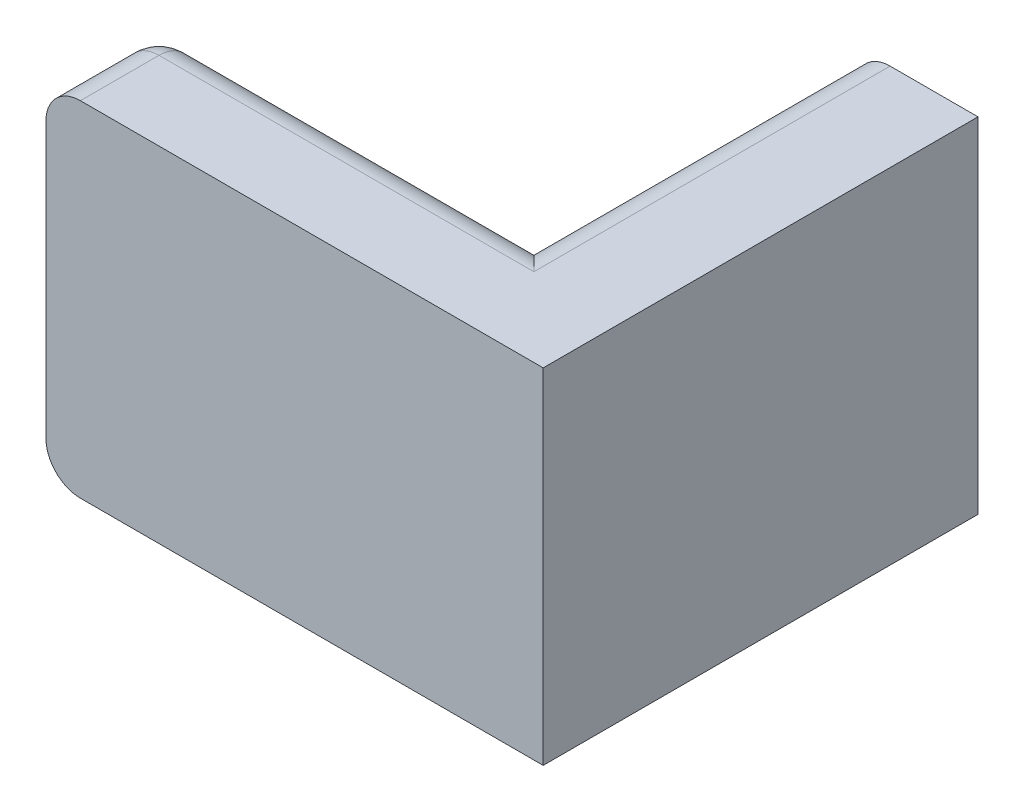
ISO-10303-21;
HEADER;
FILE_DESCRIPTION(('STEP AP214'),'2;1');
FILE_NAME('part.step','',(''),(''),'','','');
FILE_SCHEMA(('AUTOMOTIVE_DESIGN { 1 0 10303 214 1 1 1 1 }'));
ENDSEC;
DATA;
#1=APPLICATION_CONTEXT('core data for automotive mechanical design processes');
#2=APPLICATION_PROTOCOL_DEFINITION('international standard','automotive_design',2000,#1);
#3=PRODUCT_CONTEXT('',#1,'mechanical');
#4=PRODUCT('Part','Part','',(#3));
#5=PRODUCT_RELATED_PRODUCT_CATEGORY('part','',(#4));
#6=PRODUCT_DEFINITION_FORMATION('','',#4);
#7=PRODUCT_DEFINITION_CONTEXT('part definition',#1,'design');
#8=PRODUCT_DEFINITION('design','',#6,#7);
#9=PRODUCT_DEFINITION_SHAPE('','',#8);
#10=(LENGTH_UNIT() NAMED_UNIT(*) SI_UNIT(.MILLI.,.METRE.));
#11=(NAMED_UNIT(*) PLANE_ANGLE_UNIT() SI_UNIT($,.RADIAN.));
#12=(NAMED_UNIT(*) SI_UNIT($,.STERADIAN.) SOLID_ANGLE_UNIT());
#13=UNCERTAINTY_MEASURE_WITH_UNIT(LENGTH_MEASURE(1.E-05),#10,'distance_accuracy_value','');
#14=(GEOMETRIC_REPRESENTATION_CONTEXT(3) GLOBAL_UNCERTAINTY_ASSIGNED_CONTEXT((#13)) GLOBAL_UNIT_ASSIGNED_CONTEXT((#10,
#11,#12)) REPRESENTATION_CONTEXT('',''));
#15=CARTESIAN_POINT('',(0.,0.,0.));
#16=DIRECTION('',(0.,0.,1.));
#17=DIRECTION('',(1.,0.,0.));
#18=AXIS2_PLACEMENT_3D('',#15,#16,#17);
#19=CARTESIAN_POINT('',(0.,50.,-16.4145796064401));
#20=DIRECTION('',(1.,0.,0.));
#21=DIRECTION('',(0.,0.,-1.));
#22=AXIS2_PLACEMENT_3D('',#19,#20,#21);
#23=PLANE('',#22);
#24=DIRECTION('',(0.,-1.,0.));
#25=VECTOR('',#24,1.);
#26=CARTESIAN_POINT('',(0.,50.,0.));
#27=LINE('',#26,#25);
#28=CARTESIAN_POINT('',(0.,45.,0.));
#29=VERTEX_POINT('',#28);
#30=CARTESIAN_POINT('',(0.,5.,0.));
#31=VERTEX_POINT('',#30);
#32=EDGE_CURVE('E137',#29,#31,#27,.T.);
#33=ORIENTED_EDGE('',*,*,#32,.F.);
#34=DIRECTION('',(0.,0.,1.));
#35=VECTOR('',#34,1.);
#36=CARTESIAN_POINT('',(0.,45.,-16.4145796064401));
#37=LINE('',#36,#35);
#38=CARTESIAN_POINT('',(0.,45.,-11.4145796064401));
#39=VERTEX_POINT('',#38);
#40=EDGE_CURVE('E11',#29,#39,#37,.F.);
#41=ORIENTED_EDGE('',*,*,#40,.T.);
#42=DIRECTION('',(0.,-1.,0.));
#43=VECTOR('',#42,1.);
#44=CARTESIAN_POINT('',(0.,50.,-11.4145796064401));
#45=LINE('',#44,#43);
#46=CARTESIAN_POINT('',(0.,5.,-11.4145796064401));
#47=VERTEX_POINT('',#46);
#48=EDGE_CURVE('E48',#39,#47,#45,.T.);
#49=ORIENTED_EDGE('',*,*,#48,.T.);
#50=DIRECTION('',(0.,0.,1.));
#51=VECTOR('',#50,1.);
#52=CARTESIAN_POINT('',(0.,5.,-16.4145796064401));
#53=LINE('',#52,#51);
#54=EDGE_CURVE('E191',#47,#31,#53,.T.);
#55=ORIENTED_EDGE('',*,*,#54,.T.);
#56=EDGE_LOOP('',(#33,#41,#49,#55));
#57=FACE_BOUND('',#56,.T.);
#58=ADVANCED_FACE('F39',(#57),#23,.F.);
#59=CARTESIAN_POINT('',(0.,50.,0.));
#60=DIRECTION('',(0.,0.,-1.));
#61=DIRECTION('',(-1.,0.,0.));
#62=AXIS2_PLACEMENT_3D('',#59,#60,#61);
#63=PLANE('',#62);
#64=DIRECTION('',(1.,0.,0.));
#65=VECTOR('',#64,1.);
#66=CARTESIAN_POINT('',(0.,50.,0.));
#67=LINE('',#66,#65);
#68=CARTESIAN_POINT('',(5.,50.,0.));
#69=VERTEX_POINT('',#68);
#70=CARTESIAN_POINT('',(72.2072215575123,50.,0.));
#71=VERTEX_POINT('',#70);
#72=EDGE_CURVE('E118',#69,#71,#67,.T.);
#73=ORIENTED_EDGE('',*,*,#72,.F.);
#74=CARTESIAN_POINT('',(5.,45.,0.));
#75=DIRECTION('',(0.,0.,-1.));
#76=DIRECTION('',(-1.,0.,0.));
#77=AXIS2_PLACEMENT_3D('',#74,#75,#76);
#78=CIRCLE('',#77,5.);
#79=EDGE_CURVE('E193',#69,#29,#78,.F.);
#80=ORIENTED_EDGE('',*,*,#79,.T.);
#81=ORIENTED_EDGE('',*,*,#32,.T.);
#82=CARTESIAN_POINT('',(5.,5.,0.));
#83=DIRECTION('',(0.,0.,-1.));
#84=DIRECTION('',(-1.,0.,0.));
#85=AXIS2_PLACEMENT_3D('',#82,#83,#84);
#86=CIRCLE('',#85,5.);
#87=CARTESIAN_POINT('',(5.,0.,0.));
#88=VERTEX_POINT('',#87);
#89=EDGE_CURVE('E188',#31,#88,#86,.F.);
#90=ORIENTED_EDGE('',*,*,#89,.T.);
#91=DIRECTION('',(1.,0.,0.));
#92=VECTOR('',#91,1.);
#93=CARTESIAN_POINT('',(0.,0.,0.));
#94=LINE('',#93,#92);
#95=CARTESIAN_POINT('',(72.2072215575123,0.,0.));
#96=VERTEX_POINT('',#95);
#97=EDGE_CURVE('E138',#88,#96,#94,.T.);
#98=ORIENTED_EDGE('',*,*,#97,.T.);
#99=DIRECTION('',(0.,-1.,0.));
#100=VECTOR('',#99,1.);
#101=CARTESIAN_POINT('',(72.2072215575123,50.,0.));
#102=LINE('',#101,#100);
#103=EDGE_CURVE('E132',#71,#96,#102,.T.);
#104=ORIENTED_EDGE('',*,*,#103,.F.);
#105=EDGE_LOOP('',(#73,#80,#81,#90,#98,#104));
#106=FACE_BOUND('',#105,.T.);
#107=ADVANCED_FACE('F133',(#106),#63,.F.);
#108=CARTESIAN_POINT('',(72.2072215575123,50.,0.));
#109=DIRECTION('',(-1.,0.,0.));
#110=DIRECTION('',(0.,0.,1.));
#111=AXIS2_PLACEMENT_3D('',#108,#109,#110);
#112=PLANE('',#111);
#113=DIRECTION('',(0.,0.,-1.));
#114=VECTOR('',#113,1.);
#115=CARTESIAN_POINT('',(72.2072215575123,0.,0.));
#116=LINE('',#115,#114);
#117=CARTESIAN_POINT('',(72.2072215575123,0.,-63.1478533094812));
#118=VERTEX_POINT('',#117);
#119=EDGE_CURVE('E151',#96,#118,#116,.T.);
#120=ORIENTED_EDGE('',*,*,#119,.T.);
#121=DIRECTION('',(0.,-1.,0.));
#122=VECTOR('',#121,1.);
#123=CARTESIAN_POINT('',(72.2072215575123,50.,-63.1478533094812));
#124=LINE('',#123,#122);
#125=CARTESIAN_POINT('',(72.2072215575123,50.,-63.1478533094812));
#126=VERTEX_POINT('',#125);
#127=EDGE_CURVE('E139',#126,#118,#124,.T.);
#128=ORIENTED_EDGE('',*,*,#127,.F.);
#129=DIRECTION('',(0.,0.,-1.));
#130=VECTOR('',#129,1.);
#131=CARTESIAN_POINT('',(72.2072215575123,50.,0.));
#132=LINE('',#131,#130);
#133=EDGE_CURVE('E122',#71,#126,#132,.T.);
#134=ORIENTED_EDGE('',*,*,#133,.F.);
#135=ORIENTED_EDGE('',*,*,#103,.T.);
#136=EDGE_LOOP('',(#120,#128,#134,#135));
#137=FACE_BOUND('',#136,.T.);
#138=ADVANCED_FACE('F142',(#137),#112,.F.);
#139=CARTESIAN_POINT('',(72.2072215575123,50.,-63.1478533094812));
#140=DIRECTION('',(0.,0.,1.));
#141=DIRECTION('',(1.,0.,0.));
#142=AXIS2_PLACEMENT_3D('',#139,#140,#141);
#143=PLANE('',#142);
#144=DIRECTION('',(0.,-1.,0.));
#145=VECTOR('',#144,1.);
#146=CARTESIAN_POINT('',(54.4408530423065,50.,-63.1478533094812));
#147=LINE('',#146,#145);
#148=CARTESIAN_POINT('',(54.4408530423065,45.,-63.1478533094812));
#149=VERTEX_POINT('',#148);
#150=CARTESIAN_POINT('',(54.4408530423065,5.,-63.1478533094812));
#151=VERTEX_POINT('',#150);
#152=EDGE_CURVE('E160',#149,#151,#147,.T.);
#153=ORIENTED_EDGE('',*,*,#152,.F.);
#154=CARTESIAN_POINT('',(59.4408530423065,45.,-63.1478533094812));
#155=DIRECTION('',(0.,0.,1.));
#156=DIRECTION('',(1.,0.,0.));
#157=AXIS2_PLACEMENT_3D('',#154,#155,#156);
#158=CIRCLE('',#157,5.);
#159=CARTESIAN_POINT('',(59.4408530423065,50.,-63.1478533094812));
#160=VERTEX_POINT('',#159);
#161=EDGE_CURVE('E174',#149,#160,#158,.F.);
#162=ORIENTED_EDGE('',*,*,#161,.T.);
#163=DIRECTION('',(-1.,0.,0.));
#164=VECTOR('',#163,1.);
#165=CARTESIAN_POINT('',(72.2072215575123,50.,-63.1478533094812));
#166=LINE('',#165,#164);
#167=EDGE_CURVE('E144',#126,#160,#166,.T.);
#168=ORIENTED_EDGE('',*,*,#167,.F.);
#169=ORIENTED_EDGE('',*,*,#127,.T.);
#170=DIRECTION('',(-1.,0.,0.));
#171=VECTOR('',#170,1.);
#172=CARTESIAN_POINT('',(72.2072215575123,0.,-63.1478533094812));
#173=LINE('',#172,#171);
#174=CARTESIAN_POINT('',(59.4408530423065,0.,-63.1478533094812));
#175=VERTEX_POINT('',#174);
#176=EDGE_CURVE('E128',#118,#175,#173,.T.);
#177=ORIENTED_EDGE('',*,*,#176,.T.);
#178=CARTESIAN_POINT('',(59.4408530423065,5.,-63.1478533094812));
#179=DIRECTION('',(0.,0.,1.));
#180=DIRECTION('',(1.,0.,0.));
#181=AXIS2_PLACEMENT_3D('',#178,#179,#180);
#182=CIRCLE('',#181,5.);
#183=EDGE_CURVE('E172',#175,#151,#182,.F.);
#184=ORIENTED_EDGE('',*,*,#183,.T.);
#185=EDGE_LOOP('',(#153,#162,#168,#169,#177,#184));
#186=FACE_BOUND('',#185,.T.);
#187=ADVANCED_FACE('F231',(#186),#143,.F.);
#188=CARTESIAN_POINT('',(54.4408530423065,50.,-63.1478533094812));
#189=DIRECTION('',(1.,0.,0.));
#190=DIRECTION('',(0.,0.,-1.));
#191=AXIS2_PLACEMENT_3D('',#188,#189,#190);
#192=PLANE('',#191);
#193=DIRECTION('',(0.,-1.,0.));
#194=VECTOR('',#193,1.);
#195=CARTESIAN_POINT('',(54.4408530423065,50.,-16.4145796064401));
#196=LINE('',#195,#194);
#197=CARTESIAN_POINT('',(54.4408530423065,45.,-16.4145796064401));
#198=VERTEX_POINT('',#197);
#199=CARTESIAN_POINT('',(54.4408530423065,5.,-16.4145796064401));
#200=VERTEX_POINT('',#199);
#201=EDGE_CURVE('E150',#198,#200,#196,.T.);
#202=ORIENTED_EDGE('',*,*,#201,.F.);
#203=DIRECTION('',(0.,0.,1.));
#204=VECTOR('',#203,1.);
#205=CARTESIAN_POINT('',(54.4408530423065,45.,-63.1478533094812));
#206=LINE('',#205,#204);
#207=EDGE_CURVE('E171',#198,#149,#206,.F.);
#208=ORIENTED_EDGE('',*,*,#207,.T.);
#209=ORIENTED_EDGE('',*,*,#152,.T.);
#210=DIRECTION('',(0.,0.,1.));
#211=VECTOR('',#210,1.);
#212=CARTESIAN_POINT('',(54.4408530423065,5.,-63.1478533094812));
#213=LINE('',#212,#211);
#214=EDGE_CURVE('E166',#151,#200,#213,.T.);
#215=ORIENTED_EDGE('',*,*,#214,.T.);
#216=EDGE_LOOP('',(#202,#208,#209,#215));
#217=FACE_BOUND('',#216,.T.);
#218=ADVANCED_FACE('F355',(#217),#192,.F.);
#219=CARTESIAN_POINT('',(54.4408530423065,50.,-16.4145796064401));
#220=DIRECTION('',(0.,0.,1.));
#221=DIRECTION('',(1.,0.,0.));
#222=AXIS2_PLACEMENT_3D('',#219,#220,#221);
#223=PLANE('',#222);
#224=DIRECTION('',(0.,-1.,0.));
#225=VECTOR('',#224,1.);
#226=CARTESIAN_POINT('',(5.,50.,-16.4145796064401));
#227=LINE('',#226,#225);
#228=CARTESIAN_POINT('',(5.,5.,-16.4145796064401));
#229=VERTEX_POINT('',#228);
#230=CARTESIAN_POINT('',(5.,45.,-16.4145796064401));
#231=VERTEX_POINT('',#230);
#232=EDGE_CURVE('E183',#229,#231,#227,.F.);
#233=ORIENTED_EDGE('',*,*,#232,.T.);
#234=DIRECTION('',(-1.,0.,0.));
#235=VECTOR('',#234,1.);
#236=CARTESIAN_POINT('',(54.4408530423065,45.,-16.4145796064401));
#237=LINE('',#236,#235);
#238=EDGE_CURVE('E190',#231,#198,#237,.F.);
#239=ORIENTED_EDGE('',*,*,#238,.T.);
#240=ORIENTED_EDGE('',*,*,#201,.T.);
#241=DIRECTION('',(-1.,0.,0.));
#242=VECTOR('',#241,1.);
#243=CARTESIAN_POINT('',(54.4408530423065,5.,-16.4145796064401));
#244=LINE('',#243,#242);
#245=EDGE_CURVE('E181',#200,#229,#244,.T.);
#246=ORIENTED_EDGE('',*,*,#245,.T.);
#247=EDGE_LOOP('',(#233,#239,#240,#246));
#248=FACE_BOUND('',#247,.T.);
#249=ADVANCED_FACE('F342',(#248),#223,.F.);
#250=CARTESIAN_POINT('',(0.,50.,0.));
#251=DIRECTION('',(0.,1.,0.));
#252=DIRECTION('',(0.,0.,1.));
#253=AXIS2_PLACEMENT_3D('',#250,#251,#252);
#254=PLANE('',#253);
#255=ORIENTED_EDGE('',*,*,#167,.T.);
#256=DIRECTION('',(0.,0.,1.));
#257=VECTOR('',#256,1.);
#258=CARTESIAN_POINT('',(59.4408530423065,50.,-16.4145796064401));
#259=LINE('',#258,#257);
#260=CARTESIAN_POINT('',(59.4408530423065,50.,-11.4145796064401));
#261=VERTEX_POINT('',#260);
#262=EDGE_CURVE('E167',#160,#261,#259,.T.);
#263=ORIENTED_EDGE('',*,*,#262,.T.);
#264=DIRECTION('',(-1.,0.,0.));
#265=VECTOR('',#264,1.);
#266=CARTESIAN_POINT('',(0.,50.,-11.4145796064401));
#267=LINE('',#266,#265);
#268=CARTESIAN_POINT('',(5.,50.,-11.4145796064401));
#269=VERTEX_POINT('',#268);
#270=EDGE_CURVE('E163',#261,#269,#267,.T.);
#271=ORIENTED_EDGE('',*,*,#270,.T.);
#272=DIRECTION('',(0.,0.,1.));
#273=VECTOR('',#272,1.);
#274=CARTESIAN_POINT('',(5.,50.,0.));
#275=LINE('',#274,#273);
#276=EDGE_CURVE('E130',#269,#69,#275,.T.);
#277=ORIENTED_EDGE('',*,*,#276,.T.);
#278=ORIENTED_EDGE('',*,*,#72,.T.);
#279=ORIENTED_EDGE('',*,*,#133,.T.);
#280=EDGE_LOOP('',(#255,#263,#271,#277,#278,#279));
#281=FACE_BOUND('',#280,.T.);
#282=ADVANCED_FACE('F125',(#281),#254,.T.);
#283=CARTESIAN_POINT('',(0.,0.,0.));
#284=DIRECTION('',(0.,1.,0.));
#285=DIRECTION('',(0.,0.,1.));
#286=AXIS2_PLACEMENT_3D('',#283,#284,#285);
#287=PLANE('',#286);
#288=DIRECTION('',(-1.,0.,0.));
#289=VECTOR('',#288,1.);
#290=CARTESIAN_POINT('',(0.,0.,-11.4145796064401));
#291=LINE('',#290,#289);
#292=CARTESIAN_POINT('',(5.,0.,-11.4145796064401));
#293=VERTEX_POINT('',#292);
#294=CARTESIAN_POINT('',(59.4408530423065,0.,-11.4145796064401));
#295=VERTEX_POINT('',#294);
#296=EDGE_CURVE('E180',#293,#295,#291,.F.);
#297=ORIENTED_EDGE('',*,*,#296,.T.);
#298=DIRECTION('',(0.,0.,1.));
#299=VECTOR('',#298,1.);
#300=CARTESIAN_POINT('',(59.4408530423065,0.,0.));
#301=LINE('',#300,#299);
#302=EDGE_CURVE('E182',#295,#175,#301,.F.);
#303=ORIENTED_EDGE('',*,*,#302,.T.);
#304=ORIENTED_EDGE('',*,*,#176,.F.);
#305=ORIENTED_EDGE('',*,*,#119,.F.);
#306=ORIENTED_EDGE('',*,*,#97,.F.);
#307=DIRECTION('',(0.,0.,1.));
#308=VECTOR('',#307,1.);
#309=CARTESIAN_POINT('',(5.,0.,0.));
#310=LINE('',#309,#308);
#311=EDGE_CURVE('E177',#88,#293,#310,.F.);
#312=ORIENTED_EDGE('',*,*,#311,.T.);
#313=EDGE_LOOP('',(#297,#303,#304,#305,#306,#312));
#314=FACE_BOUND('',#313,.T.);
#315=ADVANCED_FACE('F229',(#314),#287,.F.);
#316=CARTESIAN_POINT('',(59.4408530423065,5.,-63.1478533094812));
#317=DIRECTION('',(0.,0.,1.));
#318=DIRECTION('',(1.,0.,0.));
#319=AXIS2_PLACEMENT_3D('',#316,#317,#318);
#320=CYLINDRICAL_SURFACE('',#319,5.);
#321=ORIENTED_EDGE('',*,*,#183,.F.);
#322=ORIENTED_EDGE('',*,*,#302,.F.);
#323=CARTESIAN_POINT('',(59.4408530423065,5.,-11.4145796064401));
#324=DIRECTION('',(-0.707106781186547,0.,0.707106781186547));
#325=DIRECTION('',(0.707106781186547,0.,0.707106781186547));
#326=AXIS2_PLACEMENT_3D('',#323,#324,#325);
#327=ELLIPSE('',#326,7.07106781186547,5.);
#328=EDGE_CURVE('E43',#200,#295,#327,.T.);
#329=ORIENTED_EDGE('',*,*,#328,.F.);
#330=ORIENTED_EDGE('',*,*,#214,.F.);
#331=EDGE_LOOP('',(#321,#322,#329,#330));
#332=FACE_BOUND('',#331,.T.);
#333=ADVANCED_FACE('F41',(#332),#320,.T.);
#334=CARTESIAN_POINT('',(5.,5.,-16.4145796064401));
#335=DIRECTION('',(0.,0.,1.));
#336=DIRECTION('',(1.,0.,0.));
#337=AXIS2_PLACEMENT_3D('',#334,#335,#336);
#338=CYLINDRICAL_SURFACE('',#337,5.);
#339=ORIENTED_EDGE('',*,*,#89,.F.);
#340=ORIENTED_EDGE('',*,*,#54,.F.);
#341=CARTESIAN_POINT('',(5.,5.,-11.4145796064401));
#342=DIRECTION('',(0.,0.,-1.));
#343=DIRECTION('',(-1.,0.,0.));
#344=AXIS2_PLACEMENT_3D('',#341,#342,#343);
#345=CIRCLE('',#344,5.);
#346=EDGE_CURVE('E215',#293,#47,#345,.T.);
#347=ORIENTED_EDGE('',*,*,#346,.F.);
#348=ORIENTED_EDGE('',*,*,#311,.F.);
#349=EDGE_LOOP('',(#339,#340,#347,#348));
#350=FACE_BOUND('',#349,.T.);
#351=ADVANCED_FACE('F265',(#350),#338,.T.);
#352=CARTESIAN_POINT('',(54.4408530423065,5.,-11.4145796064401));
#353=DIRECTION('',(-1.,0.,0.));
#354=DIRECTION('',(0.,0.,1.));
#355=AXIS2_PLACEMENT_3D('',#352,#353,#354);
#356=CYLINDRICAL_SURFACE('',#355,5.);
#357=ORIENTED_EDGE('',*,*,#328,.T.);
#358=ORIENTED_EDGE('',*,*,#296,.F.);
#359=CARTESIAN_POINT('',(5.,5.,-11.4145796064401));
#360=DIRECTION('',(-1.,0.,0.));
#361=DIRECTION('',(0.,0.,1.));
#362=AXIS2_PLACEMENT_3D('',#359,#360,#361);
#363=CIRCLE('',#362,5.);
#364=EDGE_CURVE('E209',#229,#293,#363,.T.);
#365=ORIENTED_EDGE('',*,*,#364,.F.);
#366=ORIENTED_EDGE('',*,*,#245,.F.);
#367=EDGE_LOOP('',(#357,#358,#365,#366));
#368=FACE_BOUND('',#367,.T.);
#369=ADVANCED_FACE('F225',(#368),#356,.T.);
#370=CARTESIAN_POINT('',(5.,5.,-11.4145796064401));
#371=DIRECTION('',(0.,-1.,0.));
#372=DIRECTION('',(0.,0.,-1.));
#373=AXIS2_PLACEMENT_3D('',#370,#371,#372);
#374=SPHERICAL_SURFACE('',#373,5.);
#375=ORIENTED_EDGE('',*,*,#364,.T.);
#376=ORIENTED_EDGE('',*,*,#346,.T.);
#377=CARTESIAN_POINT('',(5.,5.,-11.4145796064401));
#378=DIRECTION('',(0.,-1.,0.));
#379=DIRECTION('',(0.,0.,-1.));
#380=AXIS2_PLACEMENT_3D('',#377,#378,#379);
#381=CIRCLE('',#380,5.);
#382=EDGE_CURVE('E210',#229,#47,#381,.F.);
#383=ORIENTED_EDGE('',*,*,#382,.F.);
#384=EDGE_LOOP('',(#375,#376,#383));
#385=FACE_BOUND('',#384,.T.);
#386=ADVANCED_FACE('F255',(#385),#374,.T.);
#387=CARTESIAN_POINT('',(5.,45.,0.));
#388=DIRECTION('',(0.,0.,-1.));
#389=DIRECTION('',(-1.,0.,0.));
#390=AXIS2_PLACEMENT_3D('',#387,#388,#389);
#391=CYLINDRICAL_SURFACE('',#390,5.);
#392=ORIENTED_EDGE('',*,*,#79,.F.);
#393=ORIENTED_EDGE('',*,*,#276,.F.);
#394=CARTESIAN_POINT('',(5.,45.,-11.4145796064401));
#395=DIRECTION('',(0.,0.,-1.));
#396=DIRECTION('',(-1.,0.,0.));
#397=AXIS2_PLACEMENT_3D('',#394,#395,#396);
#398=CIRCLE('',#397,5.);
#399=EDGE_CURVE('E204',#39,#269,#398,.T.);
#400=ORIENTED_EDGE('',*,*,#399,.F.);
#401=ORIENTED_EDGE('',*,*,#40,.F.);
#402=EDGE_LOOP('',(#392,#393,#400,#401));
#403=FACE_BOUND('',#402,.T.);
#404=ADVANCED_FACE('F250',(#403),#391,.T.);
#405=CARTESIAN_POINT('',(5.,50.,-11.4145796064401));
#406=DIRECTION('',(0.,-1.,0.));
#407=DIRECTION('',(0.,0.,-1.));
#408=AXIS2_PLACEMENT_3D('',#405,#406,#407);
#409=CYLINDRICAL_SURFACE('',#408,5.);
#410=ORIENTED_EDGE('',*,*,#382,.T.);
#411=ORIENTED_EDGE('',*,*,#48,.F.);
#412=CARTESIAN_POINT('',(5.,45.,-11.4145796064401));
#413=DIRECTION('',(0.,1.,0.));
#414=DIRECTION('',(0.,0.,1.));
#415=AXIS2_PLACEMENT_3D('',#412,#413,#414);
#416=CIRCLE('',#415,5.);
#417=EDGE_CURVE('E203',#231,#39,#416,.T.);
#418=ORIENTED_EDGE('',*,*,#417,.F.);
#419=ORIENTED_EDGE('',*,*,#232,.F.);
#420=EDGE_LOOP('',(#410,#411,#418,#419));
#421=FACE_BOUND('',#420,.T.);
#422=ADVANCED_FACE('F251',(#421),#409,.T.);
#423=CARTESIAN_POINT('',(5.,45.,-11.4145796064401));
#424=DIRECTION('',(-1.,0.,0.));
#425=DIRECTION('',(0.,0.,1.));
#426=AXIS2_PLACEMENT_3D('',#423,#424,#425);
#427=SPHERICAL_SURFACE('',#426,5.);
#428=ORIENTED_EDGE('',*,*,#417,.T.);
#429=ORIENTED_EDGE('',*,*,#399,.T.);
#430=CARTESIAN_POINT('',(5.,45.,-11.4145796064401));
#431=DIRECTION('',(-1.,0.,0.));
#432=DIRECTION('',(0.,0.,1.));
#433=AXIS2_PLACEMENT_3D('',#430,#431,#432);
#434=CIRCLE('',#433,5.);
#435=EDGE_CURVE('E196',#231,#269,#434,.F.);
#436=ORIENTED_EDGE('',*,*,#435,.F.);
#437=EDGE_LOOP('',(#428,#429,#436));
#438=FACE_BOUND('',#437,.T.);
#439=ADVANCED_FACE('F247',(#438),#427,.T.);
#440=CARTESIAN_POINT('',(0.,45.,-11.4145796064401));
#441=DIRECTION('',(1.,0.,0.));
#442=DIRECTION('',(0.,0.,-1.));
#443=AXIS2_PLACEMENT_3D('',#440,#441,#442);
#444=CYLINDRICAL_SURFACE('',#443,5.);
#445=ORIENTED_EDGE('',*,*,#435,.T.);
#446=ORIENTED_EDGE('',*,*,#270,.F.);
#447=CARTESIAN_POINT('',(59.4408530423065,45.,-11.4145796064401));
#448=DIRECTION('',(0.707106781186547,0.,-0.707106781186547));
#449=DIRECTION('',(-0.707106781186547,0.,-0.707106781186547));
#450=AXIS2_PLACEMENT_3D('',#447,#448,#449);
#451=ELLIPSE('',#450,7.07106781186547,5.);
#452=EDGE_CURVE('E198',#198,#261,#451,.T.);
#453=ORIENTED_EDGE('',*,*,#452,.F.);
#454=ORIENTED_EDGE('',*,*,#238,.F.);
#455=EDGE_LOOP('',(#445,#446,#453,#454));
#456=FACE_BOUND('',#455,.T.);
#457=ADVANCED_FACE('F242',(#456),#444,.T.);
#458=CARTESIAN_POINT('',(59.4408530423065,45.,0.));
#459=DIRECTION('',(0.,0.,-1.));
#460=DIRECTION('',(-1.,0.,0.));
#461=AXIS2_PLACEMENT_3D('',#458,#459,#460);
#462=CYLINDRICAL_SURFACE('',#461,5.);
#463=ORIENTED_EDGE('',*,*,#161,.F.);
#464=ORIENTED_EDGE('',*,*,#207,.F.);
#465=ORIENTED_EDGE('',*,*,#452,.T.);
#466=ORIENTED_EDGE('',*,*,#262,.F.);
#467=EDGE_LOOP('',(#463,#464,#465,#466));
#468=FACE_BOUND('',#467,.T.);
#469=ADVANCED_FACE('F240',(#468),#462,.T.);
#470=CLOSED_SHELL('',(#58,#107,#138,#187,#218,#249,#282,#315,#333,#351,#369,#386,#404,#422,#439,
#457,#469));
#471=MANIFOLD_SOLID_BREP('B2',#470);
#472=ADVANCED_BREP_SHAPE_REPRESENTATION('',(#18,#471),#14);
#473=SHAPE_DEFINITION_REPRESENTATION(#9,#472);
ENDSEC;
END-ISO-10303-21;
